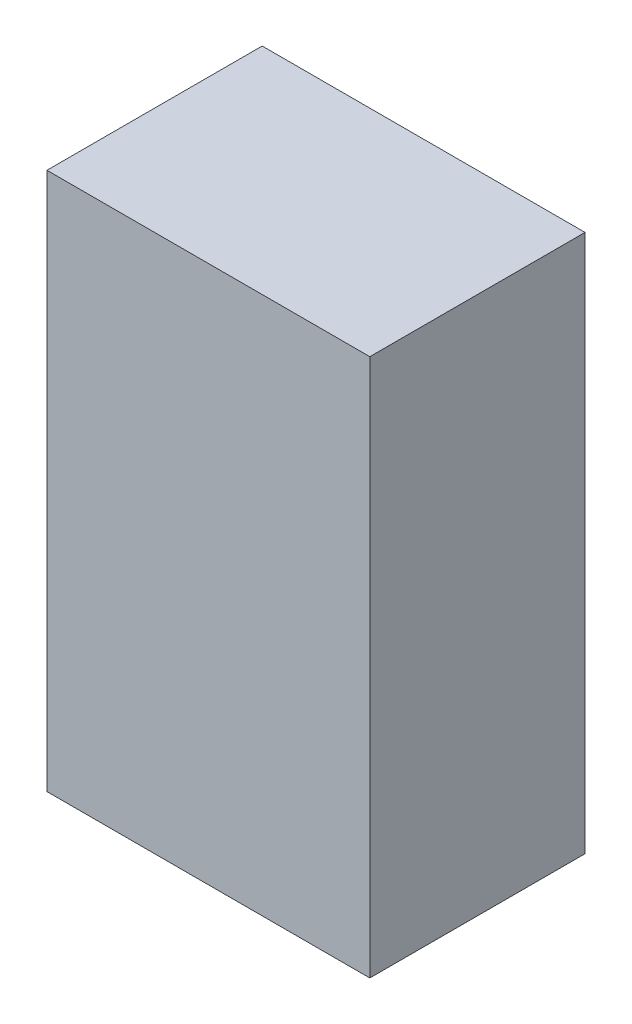
ISO-10303-21;
HEADER;
FILE_DESCRIPTION(('STEP AP214'),'2;1');
FILE_NAME('part.step','',(''),(''),'','','');
FILE_SCHEMA(('AUTOMOTIVE_DESIGN { 1 0 10303 214 1 1 1 1 }'));
ENDSEC;
DATA;
#1=APPLICATION_CONTEXT('core data for automotive mechanical design processes');
#2=APPLICATION_PROTOCOL_DEFINITION('international standard','automotive_design',2000,#1);
#3=PRODUCT_CONTEXT('',#1,'mechanical');
#4=PRODUCT('Part','Part','',(#3));
#5=PRODUCT_RELATED_PRODUCT_CATEGORY('part','',(#4));
#6=PRODUCT_DEFINITION_FORMATION('','',#4);
#7=PRODUCT_DEFINITION_CONTEXT('part definition',#1,'design');
#8=PRODUCT_DEFINITION('design','',#6,#7);
#9=PRODUCT_DEFINITION_SHAPE('','',#8);
#10=(LENGTH_UNIT() NAMED_UNIT(*) SI_UNIT(.MILLI.,.METRE.));
#11=(NAMED_UNIT(*) PLANE_ANGLE_UNIT() SI_UNIT($,.RADIAN.));
#12=(NAMED_UNIT(*) SI_UNIT($,.STERADIAN.) SOLID_ANGLE_UNIT());
#13=UNCERTAINTY_MEASURE_WITH_UNIT(LENGTH_MEASURE(1.E-05),#10,'distance_accuracy_value','');
#14=(GEOMETRIC_REPRESENTATION_CONTEXT(3) GLOBAL_UNCERTAINTY_ASSIGNED_CONTEXT((#13)) GLOBAL_UNIT_ASSIGNED_CONTEXT((#10,
#11,#12)) REPRESENTATION_CONTEXT('',''));
#15=CARTESIAN_POINT('',(0.,0.,0.));
#16=DIRECTION('',(0.,0.,1.));
#17=DIRECTION('',(1.,0.,0.));
#18=AXIS2_PLACEMENT_3D('',#15,#16,#17);
#19=CARTESIAN_POINT('',(6.,-10.,8.));
#20=DIRECTION('',(-1.,0.,0.));
#21=DIRECTION('',(0.,0.,1.));
#22=AXIS2_PLACEMENT_3D('',#19,#20,#21);
#23=PLANE('',#22);
#24=DIRECTION('',(0.,1.,0.));
#25=VECTOR('',#24,1.);
#26=CARTESIAN_POINT('',(6.,-10.,0.));
#27=LINE('',#26,#25);
#28=CARTESIAN_POINT('',(6.,-10.,0.));
#29=VERTEX_POINT('',#28);
#30=CARTESIAN_POINT('',(6.,10.,0.));
#31=VERTEX_POINT('',#30);
#32=EDGE_CURVE('E96',#29,#31,#27,.T.);
#33=ORIENTED_EDGE('',*,*,#32,.T.);
#34=DIRECTION('',(0.,0.,-1.));
#35=VECTOR('',#34,1.);
#36=CARTESIAN_POINT('',(6.,10.,8.));
#37=LINE('',#36,#35);
#38=CARTESIAN_POINT('',(6.,10.,8.));
#39=VERTEX_POINT('',#38);
#40=EDGE_CURVE('E11',#39,#31,#37,.T.);
#41=ORIENTED_EDGE('',*,*,#40,.F.);
#42=DIRECTION('',(0.,1.,0.));
#43=VECTOR('',#42,1.);
#44=CARTESIAN_POINT('',(6.,-10.,8.));
#45=LINE('',#44,#43);
#46=CARTESIAN_POINT('',(6.,-10.,8.));
#47=VERTEX_POINT('',#46);
#48=EDGE_CURVE('E84',#47,#39,#45,.T.);
#49=ORIENTED_EDGE('',*,*,#48,.F.);
#50=DIRECTION('',(0.,0.,-1.));
#51=VECTOR('',#50,1.);
#52=CARTESIAN_POINT('',(6.,-10.,8.));
#53=LINE('',#52,#51);
#54=EDGE_CURVE('E92',#47,#29,#53,.T.);
#55=ORIENTED_EDGE('',*,*,#54,.T.);
#56=EDGE_LOOP('',(#33,#41,#49,#55));
#57=FACE_BOUND('',#56,.T.);
#58=ADVANCED_FACE('F33',(#57),#23,.F.);
#59=CARTESIAN_POINT('',(-6.,10.,8.));
#60=DIRECTION('',(0.,-1.,0.));
#61=DIRECTION('',(0.,0.,-1.));
#62=AXIS2_PLACEMENT_3D('',#59,#60,#61);
#63=PLANE('',#62);
#64=DIRECTION('',(-1.,0.,0.));
#65=VECTOR('',#64,1.);
#66=CARTESIAN_POINT('',(-6.,10.,0.));
#67=LINE('',#66,#65);
#68=CARTESIAN_POINT('',(-6.,10.,0.));
#69=VERTEX_POINT('',#68);
#70=EDGE_CURVE('E88',#31,#69,#67,.T.);
#71=ORIENTED_EDGE('',*,*,#70,.T.);
#72=DIRECTION('',(0.,0.,-1.));
#73=VECTOR('',#72,1.);
#74=CARTESIAN_POINT('',(-6.,10.,8.));
#75=LINE('',#74,#73);
#76=CARTESIAN_POINT('',(-6.,10.,8.));
#77=VERTEX_POINT('',#76);
#78=EDGE_CURVE('E41',#77,#69,#75,.T.);
#79=ORIENTED_EDGE('',*,*,#78,.F.);
#80=DIRECTION('',(-1.,0.,0.));
#81=VECTOR('',#80,1.);
#82=CARTESIAN_POINT('',(-6.,10.,8.));
#83=LINE('',#82,#81);
#84=EDGE_CURVE('E79',#39,#77,#83,.T.);
#85=ORIENTED_EDGE('',*,*,#84,.F.);
#86=ORIENTED_EDGE('',*,*,#40,.T.);
#87=EDGE_LOOP('',(#71,#79,#85,#86));
#88=FACE_BOUND('',#87,.T.);
#89=ADVANCED_FACE('F87',(#88),#63,.F.);
#90=CARTESIAN_POINT('',(-6.,-10.,8.));
#91=DIRECTION('',(1.,0.,0.));
#92=DIRECTION('',(0.,0.,-1.));
#93=AXIS2_PLACEMENT_3D('',#90,#91,#92);
#94=PLANE('',#93);
#95=DIRECTION('',(0.,-1.,0.));
#96=VECTOR('',#95,1.);
#97=CARTESIAN_POINT('',(-6.,-10.,0.));
#98=LINE('',#97,#96);
#99=CARTESIAN_POINT('',(-6.,-10.,0.));
#100=VERTEX_POINT('',#99);
#101=EDGE_CURVE('E66',#69,#100,#98,.T.);
#102=ORIENTED_EDGE('',*,*,#101,.T.);
#103=DIRECTION('',(0.,0.,-1.));
#104=VECTOR('',#103,1.);
#105=CARTESIAN_POINT('',(-6.,-10.,8.));
#106=LINE('',#105,#104);
#107=CARTESIAN_POINT('',(-6.,-10.,8.));
#108=VERTEX_POINT('',#107);
#109=EDGE_CURVE('E89',#108,#100,#106,.T.);
#110=ORIENTED_EDGE('',*,*,#109,.F.);
#111=DIRECTION('',(0.,-1.,0.));
#112=VECTOR('',#111,1.);
#113=CARTESIAN_POINT('',(-6.,-10.,8.));
#114=LINE('',#113,#112);
#115=EDGE_CURVE('E82',#77,#108,#114,.T.);
#116=ORIENTED_EDGE('',*,*,#115,.F.);
#117=ORIENTED_EDGE('',*,*,#78,.T.);
#118=EDGE_LOOP('',(#102,#110,#116,#117));
#119=FACE_BOUND('',#118,.T.);
#120=ADVANCED_FACE('F90',(#119),#94,.F.);
#121=CARTESIAN_POINT('',(-6.,-10.,8.));
#122=DIRECTION('',(0.,1.,0.));
#123=DIRECTION('',(0.,0.,1.));
#124=AXIS2_PLACEMENT_3D('',#121,#122,#123);
#125=PLANE('',#124);
#126=DIRECTION('',(1.,0.,0.));
#127=VECTOR('',#126,1.);
#128=CARTESIAN_POINT('',(-6.,-10.,0.));
#129=LINE('',#128,#127);
#130=EDGE_CURVE('E72',#100,#29,#129,.T.);
#131=ORIENTED_EDGE('',*,*,#130,.T.);
#132=ORIENTED_EDGE('',*,*,#54,.F.);
#133=DIRECTION('',(1.,0.,0.));
#134=VECTOR('',#133,1.);
#135=CARTESIAN_POINT('',(-6.,-10.,8.));
#136=LINE('',#135,#134);
#137=EDGE_CURVE('E49',#108,#47,#136,.T.);
#138=ORIENTED_EDGE('',*,*,#137,.F.);
#139=ORIENTED_EDGE('',*,*,#109,.T.);
#140=EDGE_LOOP('',(#131,#132,#138,#139));
#141=FACE_BOUND('',#140,.T.);
#142=ADVANCED_FACE('F103',(#141),#125,.F.);
#143=CARTESIAN_POINT('',(0.,0.,8.));
#144=DIRECTION('',(0.,0.,-1.));
#145=DIRECTION('',(-1.,0.,0.));
#146=AXIS2_PLACEMENT_3D('',#143,#144,#145);
#147=PLANE('',#146);
#148=ORIENTED_EDGE('',*,*,#48,.T.);
#149=ORIENTED_EDGE('',*,*,#84,.T.);
#150=ORIENTED_EDGE('',*,*,#115,.T.);
#151=ORIENTED_EDGE('',*,*,#137,.T.);
#152=EDGE_LOOP('',(#148,#149,#150,#151));
#153=FACE_BOUND('',#152,.T.);
#154=ADVANCED_FACE('F80',(#153),#147,.F.);
#155=CARTESIAN_POINT('',(0.,0.,0.));
#156=DIRECTION('',(0.,0.,-1.));
#157=DIRECTION('',(-1.,0.,0.));
#158=AXIS2_PLACEMENT_3D('',#155,#156,#157);
#159=PLANE('',#158);
#160=ORIENTED_EDGE('',*,*,#32,.F.);
#161=ORIENTED_EDGE('',*,*,#130,.F.);
#162=ORIENTED_EDGE('',*,*,#101,.F.);
#163=ORIENTED_EDGE('',*,*,#70,.F.);
#164=EDGE_LOOP('',(#160,#161,#162,#163));
#165=FACE_BOUND('',#164,.T.);
#166=ADVANCED_FACE('F106',(#165),#159,.T.);
#167=CLOSED_SHELL('',(#58,#89,#120,#142,#154,#166));
#168=MANIFOLD_SOLID_BREP('B2',#167);
#169=ADVANCED_BREP_SHAPE_REPRESENTATION('',(#18,#168),#14);
#170=SHAPE_DEFINITION_REPRESENTATION(#9,#169);
ENDSEC;
END-ISO-10303-21;
